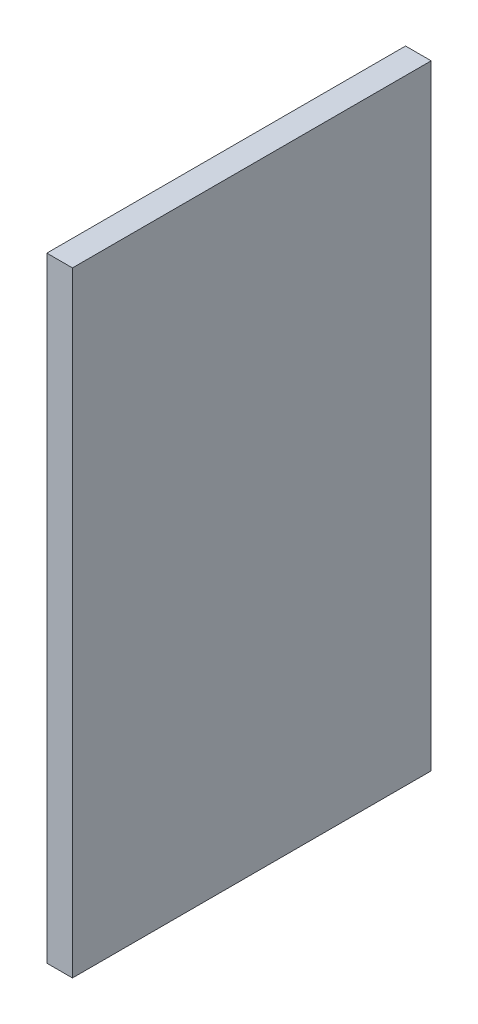
ISO-10303-21;
HEADER;
FILE_DESCRIPTION(('STEP AP214'),'2;1');
FILE_NAME('part.step','',(''),(''),'','','');
FILE_SCHEMA(('AUTOMOTIVE_DESIGN { 1 0 10303 214 1 1 1 1 }'));
ENDSEC;
DATA;
#1=APPLICATION_CONTEXT('core data for automotive mechanical design processes');
#2=APPLICATION_PROTOCOL_DEFINITION('international standard','automotive_design',2000,#1);
#3=PRODUCT_CONTEXT('',#1,'mechanical');
#4=PRODUCT('Part','Part','',(#3));
#5=PRODUCT_RELATED_PRODUCT_CATEGORY('part','',(#4));
#6=PRODUCT_DEFINITION_FORMATION('','',#4);
#7=PRODUCT_DEFINITION_CONTEXT('part definition',#1,'design');
#8=PRODUCT_DEFINITION('design','',#6,#7);
#9=PRODUCT_DEFINITION_SHAPE('','',#8);
#10=(LENGTH_UNIT() NAMED_UNIT(*) SI_UNIT(.MILLI.,.METRE.));
#11=(NAMED_UNIT(*) PLANE_ANGLE_UNIT() SI_UNIT($,.RADIAN.));
#12=(NAMED_UNIT(*) SI_UNIT($,.STERADIAN.) SOLID_ANGLE_UNIT());
#13=UNCERTAINTY_MEASURE_WITH_UNIT(LENGTH_MEASURE(1.E-05),#10,'distance_accuracy_value','');
#14=(GEOMETRIC_REPRESENTATION_CONTEXT(3) GLOBAL_UNCERTAINTY_ASSIGNED_CONTEXT((#13)) GLOBAL_UNIT_ASSIGNED_CONTEXT((#10,
#11,#12)) REPRESENTATION_CONTEXT('',''));
#15=CARTESIAN_POINT('',(0.,0.,0.));
#16=DIRECTION('',(0.,0.,1.));
#17=DIRECTION('',(1.,0.,0.));
#18=AXIS2_PLACEMENT_3D('',#15,#16,#17);
#19=CARTESIAN_POINT('',(10.,0.,0.));
#20=DIRECTION('',(0.,1.,0.));
#21=DIRECTION('',(0.,0.,1.));
#22=AXIS2_PLACEMENT_3D('',#19,#20,#21);
#23=PLANE('',#22);
#24=DIRECTION('',(0.,0.,-1.));
#25=VECTOR('',#24,1.);
#26=CARTESIAN_POINT('',(0.,0.,0.));
#27=LINE('',#26,#25);
#28=CARTESIAN_POINT('',(0.,0.,140.));
#29=VERTEX_POINT('',#28);
#30=CARTESIAN_POINT('',(0.,0.,0.));
#31=VERTEX_POINT('',#30);
#32=EDGE_CURVE('E113',#29,#31,#27,.T.);
#33=ORIENTED_EDGE('',*,*,#32,.T.);
#34=DIRECTION('',(-1.,0.,0.));
#35=VECTOR('',#34,1.);
#36=CARTESIAN_POINT('',(10.,0.,0.));
#37=LINE('',#36,#35);
#38=CARTESIAN_POINT('',(10.,0.,0.));
#39=VERTEX_POINT('',#38);
#40=EDGE_CURVE('E11',#39,#31,#37,.T.);
#41=ORIENTED_EDGE('',*,*,#40,.F.);
#42=DIRECTION('',(0.,0.,-1.));
#43=VECTOR('',#42,1.);
#44=CARTESIAN_POINT('',(10.,0.,0.));
#45=LINE('',#44,#43);
#46=CARTESIAN_POINT('',(10.,0.,140.));
#47=VERTEX_POINT('',#46);
#48=EDGE_CURVE('E97',#47,#39,#45,.T.);
#49=ORIENTED_EDGE('',*,*,#48,.F.);
#50=DIRECTION('',(-1.,0.,0.));
#51=VECTOR('',#50,1.);
#52=CARTESIAN_POINT('',(10.,0.,140.));
#53=LINE('',#52,#51);
#54=EDGE_CURVE('E109',#47,#29,#53,.T.);
#55=ORIENTED_EDGE('',*,*,#54,.T.);
#56=EDGE_LOOP('',(#33,#41,#49,#55));
#57=FACE_BOUND('',#56,.T.);
#58=ADVANCED_FACE('F45',(#57),#23,.F.);
#59=CARTESIAN_POINT('',(10.,0.,0.));
#60=DIRECTION('',(0.,0.,1.));
#61=DIRECTION('',(1.,0.,0.));
#62=AXIS2_PLACEMENT_3D('',#59,#60,#61);
#63=PLANE('',#62);
#64=DIRECTION('',(0.,1.,0.));
#65=VECTOR('',#64,1.);
#66=CARTESIAN_POINT('',(0.,0.,0.));
#67=LINE('',#66,#65);
#68=CARTESIAN_POINT('',(0.,240.,0.));
#69=VERTEX_POINT('',#68);
#70=EDGE_CURVE('E102',#31,#69,#67,.T.);
#71=ORIENTED_EDGE('',*,*,#70,.T.);
#72=DIRECTION('',(-1.,0.,0.));
#73=VECTOR('',#72,1.);
#74=CARTESIAN_POINT('',(10.,240.,0.));
#75=LINE('',#74,#73);
#76=CARTESIAN_POINT('',(10.,240.,0.));
#77=VERTEX_POINT('',#76);
#78=EDGE_CURVE('E54',#77,#69,#75,.T.);
#79=ORIENTED_EDGE('',*,*,#78,.F.);
#80=DIRECTION('',(0.,1.,0.));
#81=VECTOR('',#80,1.);
#82=CARTESIAN_POINT('',(10.,0.,0.));
#83=LINE('',#82,#81);
#84=EDGE_CURVE('E92',#39,#77,#83,.T.);
#85=ORIENTED_EDGE('',*,*,#84,.F.);
#86=ORIENTED_EDGE('',*,*,#40,.T.);
#87=EDGE_LOOP('',(#71,#79,#85,#86));
#88=FACE_BOUND('',#87,.T.);
#89=ADVANCED_FACE('F101',(#88),#63,.F.);
#90=CARTESIAN_POINT('',(10.,240.,0.));
#91=DIRECTION('',(0.,-1.,0.));
#92=DIRECTION('',(0.,0.,-1.));
#93=AXIS2_PLACEMENT_3D('',#90,#91,#92);
#94=PLANE('',#93);
#95=DIRECTION('',(0.,0.,1.));
#96=VECTOR('',#95,1.);
#97=CARTESIAN_POINT('',(0.,240.,0.));
#98=LINE('',#97,#96);
#99=CARTESIAN_POINT('',(0.,240.,140.));
#100=VERTEX_POINT('',#99);
#101=EDGE_CURVE('E79',#69,#100,#98,.T.);
#102=ORIENTED_EDGE('',*,*,#101,.T.);
#103=DIRECTION('',(-1.,0.,0.));
#104=VECTOR('',#103,1.);
#105=CARTESIAN_POINT('',(10.,240.,140.));
#106=LINE('',#105,#104);
#107=CARTESIAN_POINT('',(10.,240.,140.));
#108=VERTEX_POINT('',#107);
#109=EDGE_CURVE('E104',#108,#100,#106,.T.);
#110=ORIENTED_EDGE('',*,*,#109,.F.);
#111=DIRECTION('',(0.,0.,1.));
#112=VECTOR('',#111,1.);
#113=CARTESIAN_POINT('',(10.,240.,0.));
#114=LINE('',#113,#112);
#115=EDGE_CURVE('E95',#77,#108,#114,.T.);
#116=ORIENTED_EDGE('',*,*,#115,.F.);
#117=ORIENTED_EDGE('',*,*,#78,.T.);
#118=EDGE_LOOP('',(#102,#110,#116,#117));
#119=FACE_BOUND('',#118,.T.);
#120=ADVANCED_FACE('F105',(#119),#94,.F.);
#121=CARTESIAN_POINT('',(10.,0.,140.));
#122=DIRECTION('',(0.,0.,-1.));
#123=DIRECTION('',(-1.,0.,0.));
#124=AXIS2_PLACEMENT_3D('',#121,#122,#123);
#125=PLANE('',#124);
#126=DIRECTION('',(0.,-1.,0.));
#127=VECTOR('',#126,1.);
#128=CARTESIAN_POINT('',(0.,0.,140.));
#129=LINE('',#128,#127);
#130=EDGE_CURVE('E85',#100,#29,#129,.T.);
#131=ORIENTED_EDGE('',*,*,#130,.T.);
#132=ORIENTED_EDGE('',*,*,#54,.F.);
#133=DIRECTION('',(0.,-1.,0.));
#134=VECTOR('',#133,1.);
#135=CARTESIAN_POINT('',(10.,0.,140.));
#136=LINE('',#135,#134);
#137=EDGE_CURVE('E62',#108,#47,#136,.T.);
#138=ORIENTED_EDGE('',*,*,#137,.F.);
#139=ORIENTED_EDGE('',*,*,#109,.T.);
#140=EDGE_LOOP('',(#131,#132,#138,#139));
#141=FACE_BOUND('',#140,.T.);
#142=ADVANCED_FACE('F126',(#141),#125,.F.);
#143=CARTESIAN_POINT('',(10.,0.,0.));
#144=DIRECTION('',(-1.,0.,0.));
#145=DIRECTION('',(0.,0.,1.));
#146=AXIS2_PLACEMENT_3D('',#143,#144,#145);
#147=PLANE('',#146);
#148=ORIENTED_EDGE('',*,*,#48,.T.);
#149=ORIENTED_EDGE('',*,*,#84,.T.);
#150=ORIENTED_EDGE('',*,*,#115,.T.);
#151=ORIENTED_EDGE('',*,*,#137,.T.);
#152=EDGE_LOOP('',(#148,#149,#150,#151));
#153=FACE_BOUND('',#152,.T.);
#154=ADVANCED_FACE('F93',(#153),#147,.F.);
#155=CARTESIAN_POINT('',(0.,0.,0.));
#156=DIRECTION('',(-1.,0.,0.));
#157=DIRECTION('',(0.,0.,1.));
#158=AXIS2_PLACEMENT_3D('',#155,#156,#157);
#159=PLANE('',#158);
#160=ORIENTED_EDGE('',*,*,#32,.F.);
#161=ORIENTED_EDGE('',*,*,#130,.F.);
#162=ORIENTED_EDGE('',*,*,#101,.F.);
#163=ORIENTED_EDGE('',*,*,#70,.F.);
#164=EDGE_LOOP('',(#160,#161,#162,#163));
#165=FACE_BOUND('',#164,.T.);
#166=ADVANCED_FACE('F129',(#165),#159,.T.);
#167=CLOSED_SHELL('',(#58,#89,#120,#142,#154,#166));
#168=MANIFOLD_SOLID_BREP('B2',#167);
#169=ADVANCED_BREP_SHAPE_REPRESENTATION('',(#18,#168),#14);
#170=SHAPE_DEFINITION_REPRESENTATION(#9,#169);
ENDSEC;
END-ISO-10303-21;
